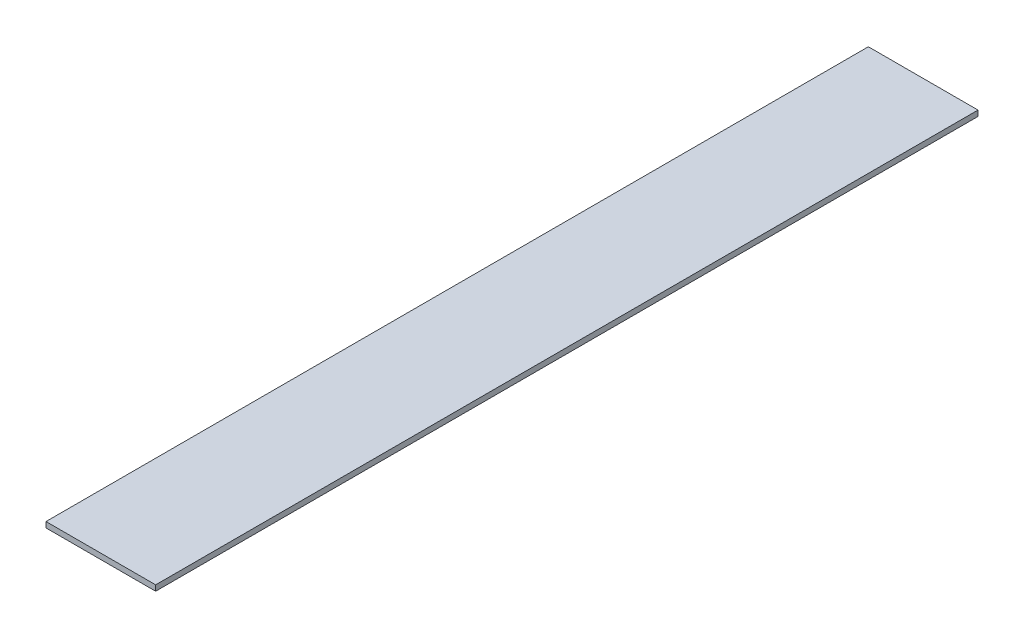
ISO-10303-21;
HEADER;
FILE_DESCRIPTION(('STEP AP214'),'2;1');
FILE_NAME('part.step','',(''),(''),'','','');
FILE_SCHEMA(('AUTOMOTIVE_DESIGN { 1 0 10303 214 1 1 1 1 }'));
ENDSEC;
DATA;
#1=APPLICATION_CONTEXT('core data for automotive mechanical design processes');
#2=APPLICATION_PROTOCOL_DEFINITION('international standard','automotive_design',2000,#1);
#3=PRODUCT_CONTEXT('',#1,'mechanical');
#4=PRODUCT('Part','Part','',(#3));
#5=PRODUCT_RELATED_PRODUCT_CATEGORY('part','',(#4));
#6=PRODUCT_DEFINITION_FORMATION('','',#4);
#7=PRODUCT_DEFINITION_CONTEXT('part definition',#1,'design');
#8=PRODUCT_DEFINITION('design','',#6,#7);
#9=PRODUCT_DEFINITION_SHAPE('','',#8);
#10=(LENGTH_UNIT() NAMED_UNIT(*) SI_UNIT(.MILLI.,.METRE.));
#11=(NAMED_UNIT(*) PLANE_ANGLE_UNIT() SI_UNIT($,.RADIAN.));
#12=(NAMED_UNIT(*) SI_UNIT($,.STERADIAN.) SOLID_ANGLE_UNIT());
#13=UNCERTAINTY_MEASURE_WITH_UNIT(LENGTH_MEASURE(1.E-05),#10,'distance_accuracy_value','');
#14=(GEOMETRIC_REPRESENTATION_CONTEXT(3) GLOBAL_UNCERTAINTY_ASSIGNED_CONTEXT((#13)) GLOBAL_UNIT_ASSIGNED_CONTEXT((#10,
#11,#12)) REPRESENTATION_CONTEXT('',''));
#15=CARTESIAN_POINT('',(0.,0.,0.));
#16=DIRECTION('',(0.,0.,1.));
#17=DIRECTION('',(1.,0.,0.));
#18=AXIS2_PLACEMENT_3D('',#15,#16,#17);
#19=CARTESIAN_POINT('',(-1000.,-101.6,1000.));
#20=DIRECTION('',(-1.,0.,0.));
#21=DIRECTION('',(0.,0.,1.));
#22=AXIS2_PLACEMENT_3D('',#19,#20,#21);
#23=PLANE('',#22);
#24=DIRECTION('',(0.,0.,1.));
#25=VECTOR('',#24,1.);
#26=CARTESIAN_POINT('',(-1000.,0.,1000.));
#27=LINE('',#26,#25);
#28=CARTESIAN_POINT('',(-1000.,0.,-14000.));
#29=VERTEX_POINT('',#28);
#30=CARTESIAN_POINT('',(-1000.,0.,1000.));
#31=VERTEX_POINT('',#30);
#32=EDGE_CURVE('E109',#29,#31,#27,.T.);
#33=ORIENTED_EDGE('',*,*,#32,.F.);
#34=DIRECTION('',(0.,1.,0.));
#35=VECTOR('',#34,1.);
#36=CARTESIAN_POINT('',(-1000.,-101.6,-14000.));
#37=LINE('',#36,#35);
#38=CARTESIAN_POINT('',(-1000.,-101.6,-14000.));
#39=VERTEX_POINT('',#38);
#40=EDGE_CURVE('E11',#39,#29,#37,.T.);
#41=ORIENTED_EDGE('',*,*,#40,.F.);
#42=DIRECTION('',(0.,0.,1.));
#43=VECTOR('',#42,1.);
#44=CARTESIAN_POINT('',(-1000.,-101.6,1000.));
#45=LINE('',#44,#43);
#46=CARTESIAN_POINT('',(-1000.,-101.6,1000.));
#47=VERTEX_POINT('',#46);
#48=EDGE_CURVE('E101',#39,#47,#45,.T.);
#49=ORIENTED_EDGE('',*,*,#48,.T.);
#50=DIRECTION('',(0.,1.,0.));
#51=VECTOR('',#50,1.);
#52=CARTESIAN_POINT('',(-1000.,-101.6,1000.));
#53=LINE('',#52,#51);
#54=EDGE_CURVE('E42',#47,#31,#53,.T.);
#55=ORIENTED_EDGE('',*,*,#54,.T.);
#56=EDGE_LOOP('',(#33,#41,#49,#55));
#57=FACE_BOUND('',#56,.T.);
#58=ADVANCED_FACE('F39',(#57),#23,.T.);
#59=CARTESIAN_POINT('',(-1000.,-101.6,-14000.));
#60=DIRECTION('',(0.,0.,-1.));
#61=DIRECTION('',(-1.,0.,0.));
#62=AXIS2_PLACEMENT_3D('',#59,#60,#61);
#63=PLANE('',#62);
#64=DIRECTION('',(-1.,0.,0.));
#65=VECTOR('',#64,1.);
#66=CARTESIAN_POINT('',(-1000.,0.,-14000.));
#67=LINE('',#66,#65);
#68=CARTESIAN_POINT('',(1000.,0.,-14000.));
#69=VERTEX_POINT('',#68);
#70=EDGE_CURVE('E104',#69,#29,#67,.T.);
#71=ORIENTED_EDGE('',*,*,#70,.F.);
#72=DIRECTION('',(0.,1.,0.));
#73=VECTOR('',#72,1.);
#74=CARTESIAN_POINT('',(1000.,-101.6,-14000.));
#75=LINE('',#74,#73);
#76=CARTESIAN_POINT('',(1000.,-101.6,-14000.));
#77=VERTEX_POINT('',#76);
#78=EDGE_CURVE('E49',#77,#69,#75,.T.);
#79=ORIENTED_EDGE('',*,*,#78,.F.);
#80=DIRECTION('',(-1.,0.,0.));
#81=VECTOR('',#80,1.);
#82=CARTESIAN_POINT('',(-1000.,-101.6,-14000.));
#83=LINE('',#82,#81);
#84=EDGE_CURVE('E96',#77,#39,#83,.T.);
#85=ORIENTED_EDGE('',*,*,#84,.T.);
#86=ORIENTED_EDGE('',*,*,#40,.T.);
#87=EDGE_LOOP('',(#71,#79,#85,#86));
#88=FACE_BOUND('',#87,.T.);
#89=ADVANCED_FACE('F125',(#88),#63,.T.);
#90=CARTESIAN_POINT('',(1000.,-101.6,1000.));
#91=DIRECTION('',(1.,0.,0.));
#92=DIRECTION('',(0.,0.,-1.));
#93=AXIS2_PLACEMENT_3D('',#90,#91,#92);
#94=PLANE('',#93);
#95=DIRECTION('',(0.,0.,-1.));
#96=VECTOR('',#95,1.);
#97=CARTESIAN_POINT('',(1000.,0.,1000.));
#98=LINE('',#97,#96);
#99=CARTESIAN_POINT('',(1000.,0.,1000.));
#100=VERTEX_POINT('',#99);
#101=EDGE_CURVE('E90',#100,#69,#98,.T.);
#102=ORIENTED_EDGE('',*,*,#101,.F.);
#103=DIRECTION('',(0.,1.,0.));
#104=VECTOR('',#103,1.);
#105=CARTESIAN_POINT('',(1000.,-101.6,1000.));
#106=LINE('',#105,#104);
#107=CARTESIAN_POINT('',(1000.,-101.6,1000.));
#108=VERTEX_POINT('',#107);
#109=EDGE_CURVE('E85',#108,#100,#106,.T.);
#110=ORIENTED_EDGE('',*,*,#109,.F.);
#111=DIRECTION('',(0.,0.,-1.));
#112=VECTOR('',#111,1.);
#113=CARTESIAN_POINT('',(1000.,-101.6,1000.));
#114=LINE('',#113,#112);
#115=EDGE_CURVE('E88',#108,#77,#114,.T.);
#116=ORIENTED_EDGE('',*,*,#115,.T.);
#117=ORIENTED_EDGE('',*,*,#78,.T.);
#118=EDGE_LOOP('',(#102,#110,#116,#117));
#119=FACE_BOUND('',#118,.T.);
#120=ADVANCED_FACE('F87',(#119),#94,.T.);
#121=CARTESIAN_POINT('',(-1000.,-101.6,1000.));
#122=DIRECTION('',(0.,0.,1.));
#123=DIRECTION('',(1.,0.,0.));
#124=AXIS2_PLACEMENT_3D('',#121,#122,#123);
#125=PLANE('',#124);
#126=DIRECTION('',(1.,0.,0.));
#127=VECTOR('',#126,1.);
#128=CARTESIAN_POINT('',(-1000.,0.,1000.));
#129=LINE('',#128,#127);
#130=EDGE_CURVE('E113',#31,#100,#129,.T.);
#131=ORIENTED_EDGE('',*,*,#130,.F.);
#132=ORIENTED_EDGE('',*,*,#54,.F.);
#133=DIRECTION('',(1.,0.,0.));
#134=VECTOR('',#133,1.);
#135=CARTESIAN_POINT('',(-1000.,-101.6,1000.));
#136=LINE('',#135,#134);
#137=EDGE_CURVE('E95',#47,#108,#136,.T.);
#138=ORIENTED_EDGE('',*,*,#137,.T.);
#139=ORIENTED_EDGE('',*,*,#109,.T.);
#140=EDGE_LOOP('',(#131,#132,#138,#139));
#141=FACE_BOUND('',#140,.T.);
#142=ADVANCED_FACE('F99',(#141),#125,.T.);
#143=CARTESIAN_POINT('',(0.,-101.6,0.));
#144=DIRECTION('',(0.,-1.,0.));
#145=DIRECTION('',(0.,0.,-1.));
#146=AXIS2_PLACEMENT_3D('',#143,#144,#145);
#147=PLANE('',#146);
#148=ORIENTED_EDGE('',*,*,#48,.F.);
#149=ORIENTED_EDGE('',*,*,#84,.F.);
#150=ORIENTED_EDGE('',*,*,#115,.F.);
#151=ORIENTED_EDGE('',*,*,#137,.F.);
#152=EDGE_LOOP('',(#148,#149,#150,#151));
#153=FACE_BOUND('',#152,.T.);
#154=ADVANCED_FACE('F94',(#153),#147,.T.);
#155=CARTESIAN_POINT('',(0.,0.,0.));
#156=DIRECTION('',(0.,-1.,0.));
#157=DIRECTION('',(0.,0.,-1.));
#158=AXIS2_PLACEMENT_3D('',#155,#156,#157);
#159=PLANE('',#158);
#160=ORIENTED_EDGE('',*,*,#32,.T.);
#161=ORIENTED_EDGE('',*,*,#130,.T.);
#162=ORIENTED_EDGE('',*,*,#101,.T.);
#163=ORIENTED_EDGE('',*,*,#70,.T.);
#164=EDGE_LOOP('',(#160,#161,#162,#163));
#165=FACE_BOUND('',#164,.T.);
#166=ADVANCED_FACE('F124',(#165),#159,.F.);
#167=CLOSED_SHELL('',(#58,#89,#120,#142,#154,#166));
#168=MANIFOLD_SOLID_BREP('B2',#167);
#169=ADVANCED_BREP_SHAPE_REPRESENTATION('',(#18,#168),#14);
#170=SHAPE_DEFINITION_REPRESENTATION(#9,#169);
ENDSEC;
END-ISO-10303-21;
